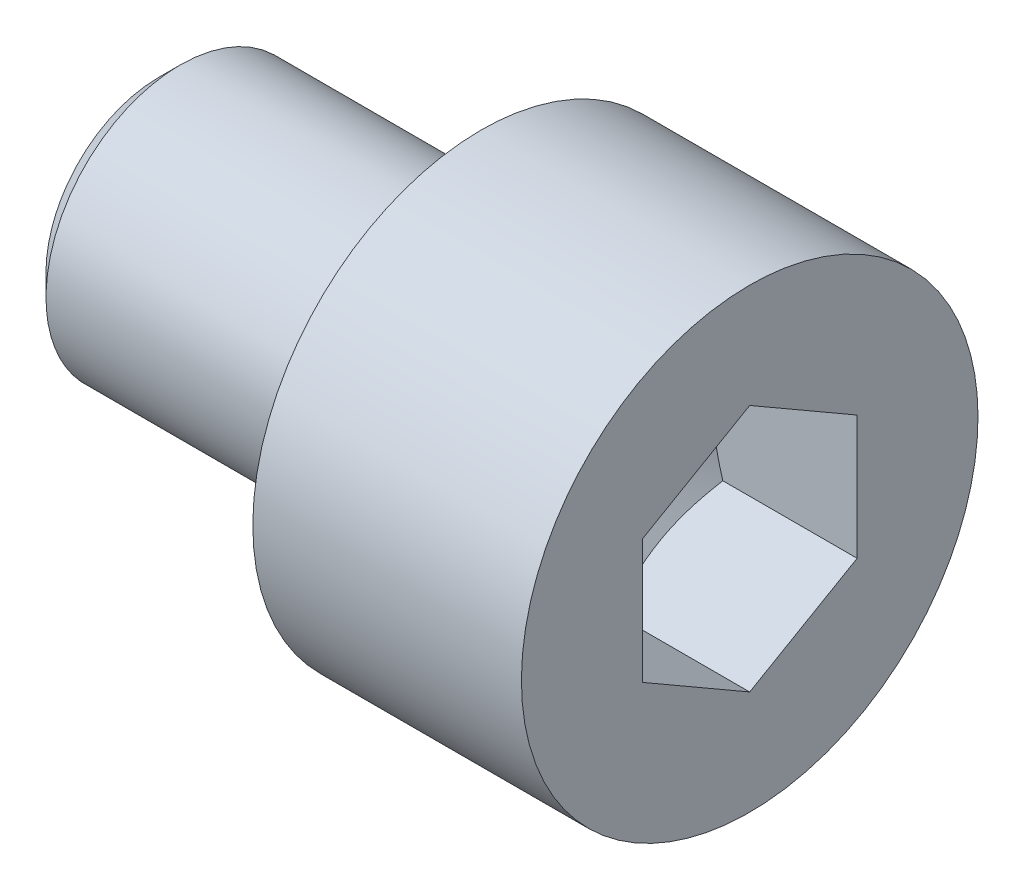
ISO-10303-21;
HEADER;
FILE_DESCRIPTION(('STEP AP214'),'2;1');
FILE_NAME('part.step','',(''),(''),'','','');
FILE_SCHEMA(('AUTOMOTIVE_DESIGN { 1 0 10303 214 1 1 1 1 }'));
ENDSEC;
DATA;
#1=APPLICATION_CONTEXT('core data for automotive mechanical design processes');
#2=APPLICATION_PROTOCOL_DEFINITION('international standard','automotive_design',2000,#1);
#3=PRODUCT_CONTEXT('',#1,'mechanical');
#4=PRODUCT('Part','Part','',(#3));
#5=PRODUCT_RELATED_PRODUCT_CATEGORY('part','',(#4));
#6=PRODUCT_DEFINITION_FORMATION('','',#4);
#7=PRODUCT_DEFINITION_CONTEXT('part definition',#1,'design');
#8=PRODUCT_DEFINITION('design','',#6,#7);
#9=PRODUCT_DEFINITION_SHAPE('','',#8);
#10=(LENGTH_UNIT() NAMED_UNIT(*) SI_UNIT(.MILLI.,.METRE.));
#11=(NAMED_UNIT(*) PLANE_ANGLE_UNIT() SI_UNIT($,.RADIAN.));
#12=(NAMED_UNIT(*) SI_UNIT($,.STERADIAN.) SOLID_ANGLE_UNIT());
#13=UNCERTAINTY_MEASURE_WITH_UNIT(LENGTH_MEASURE(1.E-05),#10,'distance_accuracy_value','');
#14=(GEOMETRIC_REPRESENTATION_CONTEXT(3) GLOBAL_UNCERTAINTY_ASSIGNED_CONTEXT((#13)) GLOBAL_UNIT_ASSIGNED_CONTEXT((#10,
#11,#12)) REPRESENTATION_CONTEXT('',''));
#15=CARTESIAN_POINT('',(0.,0.,0.));
#16=DIRECTION('',(0.,0.,1.));
#17=DIRECTION('',(1.,0.,0.));
#18=AXIS2_PLACEMENT_3D('',#15,#16,#17);
#19=CARTESIAN_POINT('',(0.099999999999972,-4.675,-4.675));
#20=CARTESIAN_POINT('',(0.099999999999972,-4.675,4.675));
#21=CARTESIAN_POINT('',(0.099999999999972,4.675,-4.675));
#22=CARTESIAN_POINT('',(0.099999999999972,4.675,4.675));
#23=(BOUNDED_SURFACE() B_SPLINE_SURFACE(1,1,((#19,#20),(#21,#22)),.UNSPECIFIED.,.F.,.F.,
.F.) B_SPLINE_SURFACE_WITH_KNOTS((2,2),(2,2),(0.,1.),(0.,1.),
.UNSPECIFIED.) GEOMETRIC_REPRESENTATION_ITEM() RATIONAL_B_SPLINE_SURFACE(((1.,1.),(1.,1.))) REPRESENTATION_ITEM('') SURFACE());
#24=CARTESIAN_POINT('',(0.099999999999975,2.30940107675856,0.));
#25=CARTESIAN_POINT('',(0.099999999999975,1.15470053837927,-1.99999999999994));
#26=(BOUNDED_CURVE() B_SPLINE_CURVE(1,(#24,#25),.UNSPECIFIED.,.F.,
.F.) B_SPLINE_CURVE_WITH_KNOTS((2,2),(0.,1.),
.UNSPECIFIED.) CURVE() GEOMETRIC_REPRESENTATION_ITEM() RATIONAL_B_SPLINE_CURVE((1.,1.)) REPRESENTATION_ITEM(''));
#27=CARTESIAN_POINT('',(0.099999999999975,2.30940107675852,0.));
#28=VERTEX_POINT('',#27);
#29=CARTESIAN_POINT('',(0.099999999999975,1.15470053837921,-1.99999999999992));
#30=VERTEX_POINT('',#29);
#31=EDGE_CURVE('P0_E168',#28,#30,#26,.T.);
#32=CARTESIAN_POINT('',(0.099999999999975,1.15470053837927,-1.99999999999994));
#33=CARTESIAN_POINT('',(0.099999999999975,-1.15470053837921,-1.99999999999993));
#34=(BOUNDED_CURVE() B_SPLINE_CURVE(1,(#32,#33),.UNSPECIFIED.,.F.,
.F.) B_SPLINE_CURVE_WITH_KNOTS((2,2),(0.,1.),
.UNSPECIFIED.) CURVE() GEOMETRIC_REPRESENTATION_ITEM() RATIONAL_B_SPLINE_CURVE((1.,1.)) REPRESENTATION_ITEM(''));
#35=CARTESIAN_POINT('',(0.099999999999975,-1.15470053837927,-1.99999999999989));
#36=VERTEX_POINT('',#35);
#37=EDGE_CURVE('P0_E189',#30,#36,#34,.T.);
#38=CARTESIAN_POINT('',(0.099999999999975,-1.15470053837921,-1.99999999999993));
#39=CARTESIAN_POINT('',(0.099999999999975,-2.30940107675845,1.101549E-13));
#40=(BOUNDED_CURVE() B_SPLINE_CURVE(1,(#38,#39),.UNSPECIFIED.,.F.,
.F.) B_SPLINE_CURVE_WITH_KNOTS((2,2),(0.,1.),
.UNSPECIFIED.) CURVE() GEOMETRIC_REPRESENTATION_ITEM() RATIONAL_B_SPLINE_CURVE((1.,1.)) REPRESENTATION_ITEM(''));
#41=CARTESIAN_POINT('',(0.099999999999975,-2.30940107675849,1.587272E-13));
#42=VERTEX_POINT('',#41);
#43=EDGE_CURVE('P0_E141',#36,#42,#40,.T.);
#44=CARTESIAN_POINT('',(0.099999999999975,-2.30940107675845,1.101549E-13));
#45=CARTESIAN_POINT('',(0.099999999999975,-1.15470053837918,2.0000000000001));
#46=(BOUNDED_CURVE() B_SPLINE_CURVE(1,(#44,#45),.UNSPECIFIED.,.F.,
.F.) B_SPLINE_CURVE_WITH_KNOTS((2,2),(0.,1.),
.UNSPECIFIED.) CURVE() GEOMETRIC_REPRESENTATION_ITEM() RATIONAL_B_SPLINE_CURVE((1.,1.)) REPRESENTATION_ITEM(''));
#47=CARTESIAN_POINT('',(0.099999999999975,-1.15470053837921,2.00000000000014));
#48=VERTEX_POINT('',#47);
#49=EDGE_CURVE('P0_E123',#42,#48,#46,.T.);
#50=CARTESIAN_POINT('',(0.099999999999975,-1.15470053837918,2.0000000000001));
#51=CARTESIAN_POINT('',(0.099999999999975,1.1547005383794,2.));
#52=(BOUNDED_CURVE() B_SPLINE_CURVE(1,(#50,#51),.UNSPECIFIED.,.F.,
.F.) B_SPLINE_CURVE_WITH_KNOTS((2,2),(0.,1.),
.UNSPECIFIED.) CURVE() GEOMETRIC_REPRESENTATION_ITEM() RATIONAL_B_SPLINE_CURVE((1.,1.)) REPRESENTATION_ITEM(''));
#53=CARTESIAN_POINT('',(0.099999999999975,1.15470053837937,2.00000000000005));
#54=VERTEX_POINT('',#53);
#55=EDGE_CURVE('P0_E153',#48,#54,#52,.T.);
#56=CARTESIAN_POINT('',(0.099999999999975,1.1547005383794,2.));
#57=CARTESIAN_POINT('',(0.099999999999975,2.30940107675856,0.));
#58=(BOUNDED_CURVE() B_SPLINE_CURVE(1,(#56,#57),.UNSPECIFIED.,.F.,
.F.) B_SPLINE_CURVE_WITH_KNOTS((2,2),(0.,1.),
.UNSPECIFIED.) CURVE() GEOMETRIC_REPRESENTATION_ITEM() RATIONAL_B_SPLINE_CURVE((1.,1.)) REPRESENTATION_ITEM(''));
#59=EDGE_CURVE('P0_E282',#54,#28,#58,.T.);
#60=CARTESIAN_POINT('',(0.099999999999972,4.25,0.));
#61=CARTESIAN_POINT('',(0.099999999999972,4.25,7.36121593216772));
#62=CARTESIAN_POINT('',(0.099999999999972,-2.125,3.68060796608386));
#63=CARTESIAN_POINT('',(0.099999999999972,-8.5,0.));
#64=CARTESIAN_POINT('',(0.099999999999972,-2.125,-3.68060796608386));
#65=CARTESIAN_POINT('',(0.099999999999972,4.25,-7.36121593216772));
#66=CARTESIAN_POINT('',(0.099999999999972,4.25,0.));
#67=(BOUNDED_CURVE() B_SPLINE_CURVE(2,(#60,#61,#62,#63,#64,#65,#66),.UNSPECIFIED.,.T.,
.F.) B_SPLINE_CURVE_WITH_KNOTS((3,2,2,3),(0.,0.333333333333333,0.666666666666667,1.),
.UNSPECIFIED.) CURVE() GEOMETRIC_REPRESENTATION_ITEM() RATIONAL_B_SPLINE_CURVE((1.,0.5,1.,0.5,
1.,0.5,1.)) REPRESENTATION_ITEM(''));
#68=CARTESIAN_POINT('',(0.099999999999972,4.25,0.));
#69=VERTEX_POINT('',#68);
#70=EDGE_CURVE('P0_E11',#69,#69,#67,.T.);
#71=ORIENTED_EDGE('',*,*,#31,.T.);
#72=ORIENTED_EDGE('',*,*,#37,.T.);
#73=ORIENTED_EDGE('',*,*,#43,.T.);
#74=ORIENTED_EDGE('',*,*,#49,.T.);
#75=ORIENTED_EDGE('',*,*,#55,.T.);
#76=ORIENTED_EDGE('',*,*,#59,.T.);
#77=EDGE_LOOP('',(#71,#72,#73,#74,#75,#76));
#78=FACE_BOUND('',#77,.T.);
#79=ORIENTED_EDGE('',*,*,#70,.T.);
#80=EDGE_LOOP('',(#79));
#81=FACE_BOUND('',#80,.T.);
#82=ADVANCED_FACE('P0_F16',(#78,#81),#23,.T.);
#83=CARTESIAN_POINT('',(-4.9,4.25,0.));
#84=CARTESIAN_POINT('',(0.099999999999972,4.25,0.));
#85=CARTESIAN_POINT('',(-4.9,4.25,7.36121593216772));
#86=CARTESIAN_POINT('',(0.099999999999972,4.25,7.36121593216772));
#87=CARTESIAN_POINT('',(-4.9,-2.125,3.68060796608387));
#88=CARTESIAN_POINT('',(0.099999999999972,-2.125,3.68060796608386));
#89=CARTESIAN_POINT('',(-4.9,-8.5,0.));
#90=CARTESIAN_POINT('',(0.099999999999972,-8.5,0.));
#91=CARTESIAN_POINT('',(-4.9,-2.125,-3.68060796608386));
#92=CARTESIAN_POINT('',(0.099999999999972,-2.125,-3.68060796608386));
#93=CARTESIAN_POINT('',(-4.9,4.25,-7.36121593216773));
#94=CARTESIAN_POINT('',(0.099999999999972,4.25,-7.36121593216772));
#95=CARTESIAN_POINT('',(-4.9,4.25,0.));
#96=CARTESIAN_POINT('',(0.099999999999972,4.25,0.));
#97=(BOUNDED_SURFACE() B_SPLINE_SURFACE(2,1,((#83,#84),(#85,#86),(#87,#88),(#89,#90),(#91,#92),
(#93,#94),(#95,#96)),.UNSPECIFIED.,.T.,.F.,.F.) B_SPLINE_SURFACE_WITH_KNOTS((3,2,2,3),(2,2),(0.,
0.333333333333333,0.666666666666667,1.),(0.,1.),
.UNSPECIFIED.) GEOMETRIC_REPRESENTATION_ITEM() RATIONAL_B_SPLINE_SURFACE(((1.,1.),(0.5,0.5),(1.,
1.),(0.5,0.5),(1.,1.),(0.5,0.5),(1.,1.))) REPRESENTATION_ITEM('') SURFACE());
#98=CARTESIAN_POINT('',(-4.9,4.25,0.));
#99=CARTESIAN_POINT('',(-4.9,4.25,7.36121593216772));
#100=CARTESIAN_POINT('',(-4.9,-2.125,3.68060796608387));
#101=CARTESIAN_POINT('',(-4.9,-8.5,0.));
#102=CARTESIAN_POINT('',(-4.9,-2.125,-3.68060796608386));
#103=CARTESIAN_POINT('',(-4.9,4.25,-7.36121593216773));
#104=CARTESIAN_POINT('',(-4.9,4.25,0.));
#105=(BOUNDED_CURVE() B_SPLINE_CURVE(2,(#98,#99,#100,#101,#102,#103,#104),.UNSPECIFIED.,.T.,
.F.) B_SPLINE_CURVE_WITH_KNOTS((3,2,2,3),(0.,0.333333333333333,0.666666666666667,1.),
.UNSPECIFIED.) CURVE() GEOMETRIC_REPRESENTATION_ITEM() RATIONAL_B_SPLINE_CURVE((1.,0.5,1.,0.5,
1.,0.5,1.)) REPRESENTATION_ITEM(''));
#106=CARTESIAN_POINT('',(-4.9,4.25,0.));
#107=VERTEX_POINT('',#106);
#108=EDGE_CURVE('P0_E204',#107,#107,#105,.T.);
#109=CARTESIAN_POINT('',(0.099999999999972,4.25,0.));
#110=CARTESIAN_POINT('',(-4.9,4.25,0.));
#111=(BOUNDED_CURVE() B_SPLINE_CURVE(1,(#109,#110),.UNSPECIFIED.,.F.,
.F.) B_SPLINE_CURVE_WITH_KNOTS((2,2),(0.,1.),
.UNSPECIFIED.) CURVE() GEOMETRIC_REPRESENTATION_ITEM() RATIONAL_B_SPLINE_CURVE((1.,1.)) REPRESENTATION_ITEM(''));
#112=EDGE_CURVE('P0_E29',#69,#107,#111,.T.);
#113=ORIENTED_EDGE('',*,*,#108,.T.);
#114=ORIENTED_EDGE('',*,*,#112,.F.);
#115=ORIENTED_EDGE('',*,*,#70,.F.);
#116=ORIENTED_EDGE('',*,*,#112,.T.);
#117=EDGE_LOOP('',(#113,#114,#115,#116));
#118=FACE_BOUND('',#117,.T.);
#119=ADVANCED_FACE('P0_F315',(#118),#97,.T.);
#120=CARTESIAN_POINT('',(-4.9,-4.675,4.675));
#121=CARTESIAN_POINT('',(-4.9,-4.675,-4.675));
#122=CARTESIAN_POINT('',(-4.9,4.675,4.675));
#123=CARTESIAN_POINT('',(-4.9,4.675,-4.675));
#124=(BOUNDED_SURFACE() B_SPLINE_SURFACE(1,1,((#120,#121),(#122,#123)),.UNSPECIFIED.,.F.,.F.,
.F.) B_SPLINE_SURFACE_WITH_KNOTS((2,2),(2,2),(0.,1.),(0.,1.),
.UNSPECIFIED.) GEOMETRIC_REPRESENTATION_ITEM() RATIONAL_B_SPLINE_SURFACE(((1.,1.),(1.,1.))) REPRESENTATION_ITEM('') SURFACE());
#125=CARTESIAN_POINT('',(-4.9,2.49999999999766,0.));
#126=CARTESIAN_POINT('',(-4.9,2.49999999999766,4.33012701891815));
#127=CARTESIAN_POINT('',(-4.9,-1.24999999999883,2.16506350945907));
#128=CARTESIAN_POINT('',(-4.9,-4.99999999999533,0.));
#129=CARTESIAN_POINT('',(-4.9,-1.24999999999883,-2.16506350945907));
#130=CARTESIAN_POINT('',(-4.9,2.49999999999766,-4.33012701891815));
#131=CARTESIAN_POINT('',(-4.9,2.49999999999766,0.));
#132=(BOUNDED_CURVE() B_SPLINE_CURVE(2,(#125,#126,#127,#128,#129,#130,#131),.UNSPECIFIED.,.T.,
.F.) B_SPLINE_CURVE_WITH_KNOTS((3,2,2,3),(0.,0.333333333333333,0.666666666666667,1.),
.UNSPECIFIED.) CURVE() GEOMETRIC_REPRESENTATION_ITEM() RATIONAL_B_SPLINE_CURVE((1.,0.5,1.,0.5,
1.,0.5,1.)) REPRESENTATION_ITEM(''));
#133=CARTESIAN_POINT('',(-4.9,2.49999999999766,0.));
#134=VERTEX_POINT('',#133);
#135=EDGE_CURVE('P0_E235',#134,#134,#132,.T.);
#136=ORIENTED_EDGE('',*,*,#135,.T.);
#137=EDGE_LOOP('',(#136));
#138=FACE_BOUND('',#137,.T.);
#139=ORIENTED_EDGE('',*,*,#108,.F.);
#140=EDGE_LOOP('',(#139));
#141=FACE_BOUND('',#140,.T.);
#142=ADVANCED_FACE('P0_F18',(#138,#141),#124,.T.);
#143=CARTESIAN_POINT('',(-5.7,2.49999999999768,0.));
#144=CARTESIAN_POINT('',(-4.9,2.49999999999766,0.));
#145=CARTESIAN_POINT('',(-5.7,2.49999999999768,4.33012701891817));
#146=CARTESIAN_POINT('',(-4.9,2.49999999999766,4.33012701891815));
#147=CARTESIAN_POINT('',(-5.7,-1.24999999999884,2.16506350945908));
#148=CARTESIAN_POINT('',(-4.9,-1.24999999999883,2.16506350945907));
#149=CARTESIAN_POINT('',(-5.7,-4.99999999999535,0.));
#150=CARTESIAN_POINT('',(-4.9,-4.99999999999532,0.));
#151=CARTESIAN_POINT('',(-5.7,-1.24999999999884,-2.16506350945908));
#152=CARTESIAN_POINT('',(-4.9,-1.24999999999883,-2.16506350945907));
#153=CARTESIAN_POINT('',(-5.7,2.49999999999768,-4.33012701891817));
#154=CARTESIAN_POINT('',(-4.9,2.49999999999766,-4.33012701891815));
#155=CARTESIAN_POINT('',(-5.7,2.49999999999768,0.));
#156=CARTESIAN_POINT('',(-4.9,2.49999999999766,0.));
#157=(BOUNDED_SURFACE() B_SPLINE_SURFACE(2,1,((#143,#144),(#145,#146),(#147,#148),(#149,#150),
(#151,#152),(#153,#154),(#155,#156)),.UNSPECIFIED.,.T.,.F.,.F.) B_SPLINE_SURFACE_WITH_KNOTS((3,
2,2,3),(2,2),(0.,0.333333333333333,0.666666666666667,1.),(0.,1.),
.UNSPECIFIED.) GEOMETRIC_REPRESENTATION_ITEM() RATIONAL_B_SPLINE_SURFACE(((1.,1.),(0.5,0.5),(1.,
1.),(0.5,0.5),(1.,1.),(0.5,0.5),(1.,1.))) REPRESENTATION_ITEM('') SURFACE());
#158=CARTESIAN_POINT('',(-5.7,2.49999999999768,0.));
#159=CARTESIAN_POINT('',(-5.7,2.49999999999768,4.33012701891817));
#160=CARTESIAN_POINT('',(-5.7,-1.24999999999884,2.16506350945908));
#161=CARTESIAN_POINT('',(-5.7,-4.99999999999535,0.));
#162=CARTESIAN_POINT('',(-5.7,-1.24999999999884,-2.16506350945908));
#163=CARTESIAN_POINT('',(-5.7,2.49999999999768,-4.33012701891817));
#164=CARTESIAN_POINT('',(-5.7,2.49999999999768,0.));
#165=(BOUNDED_CURVE() B_SPLINE_CURVE(2,(#158,#159,#160,#161,#162,#163,#164),.UNSPECIFIED.,.T.,
.F.) B_SPLINE_CURVE_WITH_KNOTS((3,2,2,3),(0.,0.333333333333333,0.666666666666667,1.),
.UNSPECIFIED.) CURVE() GEOMETRIC_REPRESENTATION_ITEM() RATIONAL_B_SPLINE_CURVE((1.,0.5,1.,0.5,
1.,0.5,1.)) REPRESENTATION_ITEM(''));
#166=CARTESIAN_POINT('',(-5.7,2.49999999999768,0.));
#167=VERTEX_POINT('',#166);
#168=EDGE_CURVE('P0_E236',#167,#167,#165,.T.);
#169=CARTESIAN_POINT('',(-4.9,2.49999999999766,0.));
#170=CARTESIAN_POINT('',(-5.7,2.49999999999768,0.));
#171=(BOUNDED_CURVE() B_SPLINE_CURVE(1,(#169,#170),.UNSPECIFIED.,.F.,
.F.) B_SPLINE_CURVE_WITH_KNOTS((2,2),(0.,1.),
.UNSPECIFIED.) CURVE() GEOMETRIC_REPRESENTATION_ITEM() RATIONAL_B_SPLINE_CURVE((1.,1.)) REPRESENTATION_ITEM(''));
#172=EDGE_CURVE('P0_E90',#134,#167,#171,.T.);
#173=ORIENTED_EDGE('',*,*,#168,.T.);
#174=ORIENTED_EDGE('',*,*,#172,.F.);
#175=ORIENTED_EDGE('',*,*,#135,.F.);
#176=ORIENTED_EDGE('',*,*,#172,.T.);
#177=EDGE_LOOP('',(#173,#174,#175,#176));
#178=FACE_BOUND('',#177,.T.);
#179=ADVANCED_FACE('P0_F318',(#178),#157,.T.);
#180=CARTESIAN_POINT('',(-5.7,-2.74999999999745,2.74999999999745));
#181=CARTESIAN_POINT('',(-5.7,-2.74999999999745,-2.74999999999745));
#182=CARTESIAN_POINT('',(-5.7,2.74999999999745,2.74999999999745));
#183=CARTESIAN_POINT('',(-5.7,2.74999999999745,-2.74999999999745));
#184=(BOUNDED_SURFACE() B_SPLINE_SURFACE(1,1,((#180,#181),(#182,#183)),.UNSPECIFIED.,.F.,.F.,
.F.) B_SPLINE_SURFACE_WITH_KNOTS((2,2),(2,2),(0.,1.),(0.,1.),
.UNSPECIFIED.) GEOMETRIC_REPRESENTATION_ITEM() RATIONAL_B_SPLINE_SURFACE(((1.,1.),(1.,1.))) REPRESENTATION_ITEM('') SURFACE());
#185=ORIENTED_EDGE('',*,*,#168,.F.);
#186=EDGE_LOOP('',(#185));
#187=FACE_BOUND('',#186,.T.);
#188=ADVANCED_FACE('P0_F326',(#187),#184,.T.);
#189=CARTESIAN_POINT('',(0.099999999999972,1.15470053837937,2.00000000000005));
#190=CARTESIAN_POINT('',(-3.80041507641945,1.15470053837937,2.00000000000005));
#191=CARTESIAN_POINT('',(0.099999999999972,2.30940107675852,0.));
#192=CARTESIAN_POINT('',(-3.80041507641945,2.30940107675852,0.));
#193=(BOUNDED_SURFACE() B_SPLINE_SURFACE(1,1,((#189,#190),(#191,#192)),.UNSPECIFIED.,.F.,.F.,
.F.) B_SPLINE_SURFACE_WITH_KNOTS((2,2),(2,2),(0.,1.),(0.,1.),
.UNSPECIFIED.) GEOMETRIC_REPRESENTATION_ITEM() RATIONAL_B_SPLINE_SURFACE(((1.,1.),(1.,1.))) REPRESENTATION_ITEM('') SURFACE());
#194=CARTESIAN_POINT('',(0.099999999999975,2.30940107675856,0.));
#195=CARTESIAN_POINT('',(-2.40000000000002,2.30940107675856,0.));
#196=(BOUNDED_CURVE() B_SPLINE_CURVE(1,(#194,#195),.UNSPECIFIED.,.F.,
.F.) B_SPLINE_CURVE_WITH_KNOTS((2,2),(0.,0.640957424022419),
.UNSPECIFIED.) CURVE() GEOMETRIC_REPRESENTATION_ITEM() RATIONAL_B_SPLINE_CURVE((1.,1.)) REPRESENTATION_ITEM(''));
#197=CARTESIAN_POINT('',(-2.40000000000002,2.30940107675855,0.));
#198=VERTEX_POINT('',#197);
#199=EDGE_CURVE('P0_E174',#28,#198,#196,.T.);
#200=CARTESIAN_POINT('',(-2.4,1.1547005383794,2.));
#201=CARTESIAN_POINT('',(0.099999999999975,1.1547005383794,2.));
#202=(BOUNDED_CURVE() B_SPLINE_CURVE(1,(#200,#201),.UNSPECIFIED.,.F.,
.F.) B_SPLINE_CURVE_WITH_KNOTS((2,2),(0.359042575977582,1.),
.UNSPECIFIED.) CURVE() GEOMETRIC_REPRESENTATION_ITEM() RATIONAL_B_SPLINE_CURVE((1.,1.)) REPRESENTATION_ITEM(''));
#203=CARTESIAN_POINT('',(-2.4,1.15470053837937,2.00000000000005));
#204=VERTEX_POINT('',#203);
#205=EDGE_CURVE('P0_E160',#204,#54,#202,.T.);
#206=CARTESIAN_POINT('',(-2.40000000000002,2.30940107675859,0.));
#207=CARTESIAN_POINT('',(-2.75010376910486,1.732050807569,1.00000000000003));
#208=CARTESIAN_POINT('',(-2.40000000000002,1.1547005383794,2.));
#209=(BOUNDED_CURVE() B_SPLINE_CURVE(2,(#206,#207,#208),.UNSPECIFIED.,.F.,
.F.) B_SPLINE_CURVE_WITH_KNOTS((3,3),(0.,1.),
.UNSPECIFIED.) CURVE() GEOMETRIC_REPRESENTATION_ITEM() RATIONAL_B_SPLINE_CURVE((1.,
1.15470053837924,1.)) REPRESENTATION_ITEM(''));
#210=EDGE_CURVE('P0_E146',#198,#204,#209,.T.);
#211=ORIENTED_EDGE('',*,*,#199,.F.);
#212=ORIENTED_EDGE('',*,*,#59,.F.);
#213=ORIENTED_EDGE('',*,*,#205,.F.);
#214=ORIENTED_EDGE('',*,*,#210,.F.);
#215=EDGE_LOOP('',(#211,#212,#213,#214));
#216=FACE_BOUND('',#215,.T.);
#217=ADVANCED_FACE('P0_F397',(#216),#193,.F.);
#218=CARTESIAN_POINT('',(-3.80041507641944,0.,0.));
#219=CARTESIAN_POINT('',(-2.40000000000002,2.3094010767586,0.));
#220=CARTESIAN_POINT('',(-3.80041507641944,0.,0.));
#221=CARTESIAN_POINT('',(-2.40000000000003,2.30940107675862,-4.00000000000006));
#222=CARTESIAN_POINT('',(-3.80041507641944,0.,0.));
#223=CARTESIAN_POINT('',(-2.40000000000002,-1.15470053837924,-2.00000000000003));
#224=CARTESIAN_POINT('',(-3.80041507641944,0.,0.));
#225=CARTESIAN_POINT('',(-2.40000000000003,-4.6188021535171,0.));
#226=CARTESIAN_POINT('',(-3.80041507641944,0.,0.));
#227=CARTESIAN_POINT('',(-2.40000000000002,-1.15470053837927,2.00000000000008));
#228=CARTESIAN_POINT('',(-3.80041507641944,0.,0.));
#229=CARTESIAN_POINT('',(-2.40000000000003,2.30940107675856,4.00000000000015));
#230=CARTESIAN_POINT('',(-3.80041507641944,0.,0.));
#231=CARTESIAN_POINT('',(-2.40000000000002,2.3094010767586,0.));
#232=(BOUNDED_SURFACE() B_SPLINE_SURFACE(2,1,((#218,#219),(#220,#221),(#222,#223),(#224,#225),
(#226,#227),(#228,#229),(#230,#231)),.UNSPECIFIED.,.T.,.F.,.F.) B_SPLINE_SURFACE_WITH_KNOTS((3,
2,2,3),(2,2),(0.,0.333333333333333,0.666666666666667,1.),(0.,1.),
.UNSPECIFIED.) GEOMETRIC_REPRESENTATION_ITEM() RATIONAL_B_SPLINE_SURFACE(((1.,1.),(0.5,0.5),(1.,
1.),(0.5,0.5),(1.,1.),(0.5,0.5),(1.,1.))) REPRESENTATION_ITEM('') SURFACE());
#233=CARTESIAN_POINT('',(-2.40000000000002,2.3094010767586,0.));
#234=CARTESIAN_POINT('',(-3.80041507641945,0.,0.));
#235=(BOUNDED_CURVE() B_SPLINE_CURVE(1,(#233,#234),.UNSPECIFIED.,.F.,
.F.) B_SPLINE_CURVE_WITH_KNOTS((2,2),(0.,1.),
.UNSPECIFIED.) CURVE() GEOMETRIC_REPRESENTATION_ITEM() RATIONAL_B_SPLINE_CURVE((1.,1.)) REPRESENTATION_ITEM(''));
#236=CARTESIAN_POINT('',(-3.80041507641945,0.,0.));
#237=VERTEX_POINT('',#236);
#238=EDGE_CURVE('P0_E101',#198,#237,#235,.T.);
#239=CARTESIAN_POINT('',(-2.4,1.1547005383794,2.));
#240=CARTESIAN_POINT('',(-2.75010376910488,1.05162E-13,2.00000000000006));
#241=CARTESIAN_POINT('',(-2.4,-1.15470053837919,2.0000000000001));
#242=(BOUNDED_CURVE() B_SPLINE_CURVE(2,(#239,#240,#241),.UNSPECIFIED.,.F.,
.F.) B_SPLINE_CURVE_WITH_KNOTS((3,3),(0.,1.),
.UNSPECIFIED.) CURVE() GEOMETRIC_REPRESENTATION_ITEM() RATIONAL_B_SPLINE_CURVE((1.,
1.15470053837926,1.)) REPRESENTATION_ITEM(''));
#243=CARTESIAN_POINT('',(-2.4,-1.15470053837921,2.00000000000014));
#244=VERTEX_POINT('',#243);
#245=EDGE_CURVE('P0_E144',#204,#244,#242,.T.);
#246=CARTESIAN_POINT('',(-2.4,-1.15470053837917,2.00000000000012));
#247=CARTESIAN_POINT('',(-2.7501037691049,-1.73205080756885,1.00000000000005));
#248=CARTESIAN_POINT('',(-2.4,-2.30940107675852,0.));
#249=(BOUNDED_CURVE() B_SPLINE_CURVE(2,(#246,#247,#248),.UNSPECIFIED.,.F.,
.F.) B_SPLINE_CURVE_WITH_KNOTS((3,3),(0.,1.),
.UNSPECIFIED.) CURVE() GEOMETRIC_REPRESENTATION_ITEM() RATIONAL_B_SPLINE_CURVE((1.,
1.15470053837927,1.)) REPRESENTATION_ITEM(''));
#250=CARTESIAN_POINT('',(-2.4,-2.30940107675849,1.587272E-13));
#251=VERTEX_POINT('',#250);
#252=EDGE_CURVE('P0_E131',#244,#251,#249,.T.);
#253=CARTESIAN_POINT('',(-2.4,-2.30940107675852,2.333203E-13));
#254=CARTESIAN_POINT('',(-2.75010376910496,-1.73205080756883,-0.999999999999922));
#255=CARTESIAN_POINT('',(-2.4,-1.15470053837913,-2.00000000000008));
#256=(BOUNDED_CURVE() B_SPLINE_CURVE(2,(#253,#254,#255),.UNSPECIFIED.,.F.,
.F.) B_SPLINE_CURVE_WITH_KNOTS((3,3),(0.,1.),
.UNSPECIFIED.) CURVE() GEOMETRIC_REPRESENTATION_ITEM() RATIONAL_B_SPLINE_CURVE((1.,
1.1547005383793,1.)) REPRESENTATION_ITEM(''));
#257=CARTESIAN_POINT('',(-2.4,-1.15470053837927,-1.99999999999989));
#258=VERTEX_POINT('',#257);
#259=EDGE_CURVE('P0_E182',#251,#258,#256,.T.);
#260=CARTESIAN_POINT('',(-2.4,-1.15470053837938,-1.99999999999993));
#261=CARTESIAN_POINT('',(-2.75010376910495,0.,-1.99999999999994));
#262=CARTESIAN_POINT('',(-2.4,1.15470053837943,-1.99999999999994));
#263=(BOUNDED_CURVE() B_SPLINE_CURVE(2,(#260,#261,#262),.UNSPECIFIED.,.F.,
.F.) B_SPLINE_CURVE_WITH_KNOTS((3,3),(0.,1.),
.UNSPECIFIED.) CURVE() GEOMETRIC_REPRESENTATION_ITEM() RATIONAL_B_SPLINE_CURVE((1.,
1.15470053837929,1.)) REPRESENTATION_ITEM(''));
#264=CARTESIAN_POINT('',(-2.40000000000002,1.15470053837921,-1.99999999999992));
#265=VERTEX_POINT('',#264);
#266=EDGE_CURVE('P0_E175',#258,#265,#263,.T.);
#267=CARTESIAN_POINT('',(-2.40000000000002,1.15470053837919,-2.00000000000009));
#268=CARTESIAN_POINT('',(-2.75010376910495,1.73205080756889,-0.999999999999985));
#269=CARTESIAN_POINT('',(-2.40000000000002,2.30940107675859,1.22298E-13));
#270=(BOUNDED_CURVE() B_SPLINE_CURVE(2,(#267,#268,#269),.UNSPECIFIED.,.F.,
.F.) B_SPLINE_CURVE_WITH_KNOTS((3,3),(0.,1.),
.UNSPECIFIED.) CURVE() GEOMETRIC_REPRESENTATION_ITEM() RATIONAL_B_SPLINE_CURVE((1.,
1.15470053837928,1.)) REPRESENTATION_ITEM(''));
#271=EDGE_CURVE('P0_E260',#265,#198,#270,.T.);
#272=ORIENTED_EDGE('',*,*,#238,.T.);
#273=ORIENTED_EDGE('',*,*,#238,.F.);
#274=ORIENTED_EDGE('',*,*,#210,.T.);
#275=ORIENTED_EDGE('',*,*,#245,.T.);
#276=ORIENTED_EDGE('',*,*,#252,.T.);
#277=ORIENTED_EDGE('',*,*,#259,.T.);
#278=ORIENTED_EDGE('',*,*,#266,.T.);
#279=ORIENTED_EDGE('',*,*,#271,.T.);
#280=EDGE_LOOP('',(#272,#273,#274,#275,#276,#277,#278,#279));
#281=FACE_BOUND('',#280,.T.);
#282=ADVANCED_FACE('P0_F145',(#281),#232,.T.);
#283=CARTESIAN_POINT('',(0.099999999999972,2.30940107675852,0.));
#284=CARTESIAN_POINT('',(-3.80041507641945,2.30940107675852,0.));
#285=CARTESIAN_POINT('',(0.099999999999972,1.15470053837921,-1.99999999999992));
#286=CARTESIAN_POINT('',(-3.80041507641945,1.15470053837921,-1.99999999999992));
#287=(BOUNDED_SURFACE() B_SPLINE_SURFACE(1,1,((#283,#284),(#285,#286)),.UNSPECIFIED.,.F.,.F.,
.F.) B_SPLINE_SURFACE_WITH_KNOTS((2,2),(2,2),(0.,1.),(0.,1.),
.UNSPECIFIED.) GEOMETRIC_REPRESENTATION_ITEM() RATIONAL_B_SPLINE_SURFACE(((1.,1.),(1.,1.))) REPRESENTATION_ITEM('') SURFACE());
#288=CARTESIAN_POINT('',(-2.40000000000002,1.15470053837927,-1.99999999999994));
#289=CARTESIAN_POINT('',(0.099999999999975,1.15470053837927,-1.99999999999994));
#290=(BOUNDED_CURVE() B_SPLINE_CURVE(1,(#288,#289),.UNSPECIFIED.,.F.,
.F.) B_SPLINE_CURVE_WITH_KNOTS((2,2),(0.359042575977581,1.),
.UNSPECIFIED.) CURVE() GEOMETRIC_REPRESENTATION_ITEM() RATIONAL_B_SPLINE_CURVE((1.,1.)) REPRESENTATION_ITEM(''));
#291=EDGE_CURVE('P0_E220',#265,#30,#290,.T.);
#292=ORIENTED_EDGE('',*,*,#291,.T.);
#293=ORIENTED_EDGE('',*,*,#31,.F.);
#294=ORIENTED_EDGE('',*,*,#199,.T.);
#295=ORIENTED_EDGE('',*,*,#271,.F.);
#296=EDGE_LOOP('',(#292,#293,#294,#295));
#297=FACE_BOUND('',#296,.T.);
#298=ADVANCED_FACE('P0_F339',(#297),#287,.F.);
#299=CARTESIAN_POINT('',(0.099999999999972,1.15470053837921,-1.99999999999992));
#300=CARTESIAN_POINT('',(-3.80041507641945,1.15470053837921,-1.99999999999992));
#301=CARTESIAN_POINT('',(0.099999999999972,-1.15470053837927,-1.99999999999989));
#302=CARTESIAN_POINT('',(-3.80041507641945,-1.15470053837927,-1.99999999999989));
#303=(BOUNDED_SURFACE() B_SPLINE_SURFACE(1,1,((#299,#300),(#301,#302)),.UNSPECIFIED.,.F.,.F.,
.F.) B_SPLINE_SURFACE_WITH_KNOTS((2,2),(2,2),(0.,1.),(0.,1.),
.UNSPECIFIED.) GEOMETRIC_REPRESENTATION_ITEM() RATIONAL_B_SPLINE_SURFACE(((1.,1.),(1.,1.))) REPRESENTATION_ITEM('') SURFACE());
#304=CARTESIAN_POINT('',(-2.4,-1.15470053837921,-1.99999999999993));
#305=CARTESIAN_POINT('',(0.099999999999975,-1.15470053837921,-1.99999999999993));
#306=(BOUNDED_CURVE() B_SPLINE_CURVE(1,(#304,#305),.UNSPECIFIED.,.F.,
.F.) B_SPLINE_CURVE_WITH_KNOTS((2,2),(0.359042575977582,1.),
.UNSPECIFIED.) CURVE() GEOMETRIC_REPRESENTATION_ITEM() RATIONAL_B_SPLINE_CURVE((1.,1.)) REPRESENTATION_ITEM(''));
#307=EDGE_CURVE('P0_E190',#258,#36,#306,.T.);
#308=ORIENTED_EDGE('',*,*,#307,.T.);
#309=ORIENTED_EDGE('',*,*,#37,.F.);
#310=ORIENTED_EDGE('',*,*,#291,.F.);
#311=ORIENTED_EDGE('',*,*,#266,.F.);
#312=EDGE_LOOP('',(#308,#309,#310,#311));
#313=FACE_BOUND('',#312,.T.);
#314=ADVANCED_FACE('P0_F349',(#313),#303,.F.);
#315=CARTESIAN_POINT('',(0.099999999999972,-1.15470053837927,-1.99999999999989));
#316=CARTESIAN_POINT('',(-3.80041507641945,-1.15470053837927,-1.99999999999989));
#317=CARTESIAN_POINT('',(0.099999999999972,-2.30940107675849,1.587272E-13));
#318=CARTESIAN_POINT('',(-3.80041507641945,-2.30940107675849,1.587272E-13));
#319=(BOUNDED_SURFACE() B_SPLINE_SURFACE(1,1,((#315,#316),(#317,#318)),.UNSPECIFIED.,.F.,.F.,
.F.) B_SPLINE_SURFACE_WITH_KNOTS((2,2),(2,2),(0.,1.),(0.,1.),
.UNSPECIFIED.) GEOMETRIC_REPRESENTATION_ITEM() RATIONAL_B_SPLINE_SURFACE(((1.,1.),(1.,1.))) REPRESENTATION_ITEM('') SURFACE());
#320=CARTESIAN_POINT('',(-2.4,-2.30940107675845,0.));
#321=CARTESIAN_POINT('',(0.099999999999975,-2.30940107675845,0.));
#322=(BOUNDED_CURVE() B_SPLINE_CURVE(1,(#320,#321),.UNSPECIFIED.,.F.,
.F.) B_SPLINE_CURVE_WITH_KNOTS((2,2),(0.359042575977584,1.),
.UNSPECIFIED.) CURVE() GEOMETRIC_REPRESENTATION_ITEM() RATIONAL_B_SPLINE_CURVE((1.,1.)) REPRESENTATION_ITEM(''));
#323=EDGE_CURVE('P0_E138',#251,#42,#322,.T.);
#324=ORIENTED_EDGE('',*,*,#323,.T.);
#325=ORIENTED_EDGE('',*,*,#43,.F.);
#326=ORIENTED_EDGE('',*,*,#307,.F.);
#327=ORIENTED_EDGE('',*,*,#259,.F.);
#328=EDGE_LOOP('',(#324,#325,#326,#327));
#329=FACE_BOUND('',#328,.T.);
#330=ADVANCED_FACE('P0_F360',(#329),#319,.F.);
#331=CARTESIAN_POINT('',(0.099999999999972,-2.30940107675849,1.587272E-13));
#332=CARTESIAN_POINT('',(-3.80041507641945,-2.30940107675849,1.587272E-13));
#333=CARTESIAN_POINT('',(0.099999999999972,-1.15470053837921,2.00000000000014));
#334=CARTESIAN_POINT('',(-3.80041507641945,-1.15470053837921,2.00000000000014));
#335=(BOUNDED_SURFACE() B_SPLINE_SURFACE(1,1,((#331,#332),(#333,#334)),.UNSPECIFIED.,.F.,.F.,
.F.) B_SPLINE_SURFACE_WITH_KNOTS((2,2),(2,2),(0.,1.),(0.,1.),
.UNSPECIFIED.) GEOMETRIC_REPRESENTATION_ITEM() RATIONAL_B_SPLINE_SURFACE(((1.,1.),(1.,1.))) REPRESENTATION_ITEM('') SURFACE());
#336=CARTESIAN_POINT('',(-2.4,-1.15470053837918,2.0000000000001));
#337=CARTESIAN_POINT('',(0.099999999999975,-1.15470053837918,2.0000000000001));
#338=(BOUNDED_CURVE() B_SPLINE_CURVE(1,(#336,#337),.UNSPECIFIED.,.F.,
.F.) B_SPLINE_CURVE_WITH_KNOTS((2,2),(0.359042575977584,1.),
.UNSPECIFIED.) CURVE() GEOMETRIC_REPRESENTATION_ITEM() RATIONAL_B_SPLINE_CURVE((1.,1.)) REPRESENTATION_ITEM(''));
#339=EDGE_CURVE('P0_E135',#244,#48,#338,.T.);
#340=ORIENTED_EDGE('',*,*,#339,.T.);
#341=ORIENTED_EDGE('',*,*,#49,.F.);
#342=ORIENTED_EDGE('',*,*,#323,.F.);
#343=ORIENTED_EDGE('',*,*,#252,.F.);
#344=EDGE_LOOP('',(#340,#341,#342,#343));
#345=FACE_BOUND('',#344,.T.);
#346=ADVANCED_FACE('P0_F133',(#345),#335,.F.);
#347=CARTESIAN_POINT('',(0.099999999999972,-1.15470053837921,2.00000000000014));
#348=CARTESIAN_POINT('',(-3.80041507641945,-1.15470053837921,2.00000000000014));
#349=CARTESIAN_POINT('',(0.099999999999972,1.15470053837937,2.00000000000005));
#350=CARTESIAN_POINT('',(-3.80041507641945,1.15470053837937,2.00000000000005));
#351=(BOUNDED_SURFACE() B_SPLINE_SURFACE(1,1,((#347,#348),(#349,#350)),.UNSPECIFIED.,.F.,.F.,
.F.) B_SPLINE_SURFACE_WITH_KNOTS((2,2),(2,2),(0.,1.),(0.,1.),
.UNSPECIFIED.) GEOMETRIC_REPRESENTATION_ITEM() RATIONAL_B_SPLINE_SURFACE(((1.,1.),(1.,1.))) REPRESENTATION_ITEM('') SURFACE());
#352=ORIENTED_EDGE('',*,*,#205,.T.);
#353=ORIENTED_EDGE('',*,*,#55,.F.);
#354=ORIENTED_EDGE('',*,*,#339,.F.);
#355=ORIENTED_EDGE('',*,*,#245,.F.);
#356=EDGE_LOOP('',(#352,#353,#354,#355));
#357=FACE_BOUND('',#356,.T.);
#358=ADVANCED_FACE('P0_F152',(#357),#351,.F.);
#359=CLOSED_SHELL('',(#82,#119,#142,#179,#188,#217,#282,#298,#314,#330,#346,#358));
#360=MANIFOLD_SOLID_BREP('P0_B1',#359);
#361=CARTESIAN_POINT('',(-5.72,-2.288,-2.288));
#362=CARTESIAN_POINT('',(-5.72,-2.288,2.288));
#363=CARTESIAN_POINT('',(-5.72,2.288,-2.288));
#364=CARTESIAN_POINT('',(-5.72,2.288,2.288));
#365=(BOUNDED_SURFACE() B_SPLINE_SURFACE(1,1,((#361,#362),(#363,#364)),.UNSPECIFIED.,.F.,.F.,
.F.) B_SPLINE_SURFACE_WITH_KNOTS((2,2),(2,2),(0.,1.),(0.,1.),
.UNSPECIFIED.) GEOMETRIC_REPRESENTATION_ITEM() RATIONAL_B_SPLINE_SURFACE(((1.,1.),(1.,1.))) REPRESENTATION_ITEM('') SURFACE());
#366=CARTESIAN_POINT('',(-5.72,2.08,0.));
#367=CARTESIAN_POINT('',(-5.72,2.08,3.60266567974325));
#368=CARTESIAN_POINT('',(-5.72,-1.04,1.80133283987163));
#369=CARTESIAN_POINT('',(-5.72,-4.16,0.));
#370=CARTESIAN_POINT('',(-5.72,-1.04,-1.80133283987163));
#371=CARTESIAN_POINT('',(-5.72,2.08,-3.60266567974325));
#372=CARTESIAN_POINT('',(-5.72,2.08,0.));
#373=(BOUNDED_CURVE() B_SPLINE_CURVE(2,(#366,#367,#368,#369,#370,#371,#372),.UNSPECIFIED.,.T.,
.F.) B_SPLINE_CURVE_WITH_KNOTS((3,2,2,3),(0.,0.333333333333333,0.666666666666667,1.),
.UNSPECIFIED.) CURVE() GEOMETRIC_REPRESENTATION_ITEM() RATIONAL_B_SPLINE_CURVE((1.,0.5,1.,0.5,
1.,0.5,1.)) REPRESENTATION_ITEM(''));
#374=CARTESIAN_POINT('',(-5.72,2.08,0.));
#375=VERTEX_POINT('',#374);
#376=EDGE_CURVE('P1_E11',#375,#375,#373,.T.);
#377=ORIENTED_EDGE('',*,*,#376,.T.);
#378=EDGE_LOOP('',(#377));
#379=FACE_BOUND('',#378,.T.);
#380=ADVANCED_FACE('P1_F16',(#379),#365,.T.);
#381=CARTESIAN_POINT('',(-10.9,2.08,0.));
#382=CARTESIAN_POINT('',(-5.72,2.08,0.));
#383=CARTESIAN_POINT('',(-10.9,2.08,3.60266567974327));
#384=CARTESIAN_POINT('',(-5.72,2.08,3.60266567974325));
#385=CARTESIAN_POINT('',(-10.9,-1.04,1.80133283987164));
#386=CARTESIAN_POINT('',(-5.72,-1.04,1.80133283987163));
#387=CARTESIAN_POINT('',(-10.9,-4.16,0.));
#388=CARTESIAN_POINT('',(-5.72,-4.16,0.));
#389=CARTESIAN_POINT('',(-10.9,-1.04,-1.80133283987164));
#390=CARTESIAN_POINT('',(-5.72,-1.04,-1.80133283987163));
#391=CARTESIAN_POINT('',(-10.9,2.08,-3.60266567974327));
#392=CARTESIAN_POINT('',(-5.72,2.08,-3.60266567974325));
#393=CARTESIAN_POINT('',(-10.9,2.08,0.));
#394=CARTESIAN_POINT('',(-5.72,2.08,0.));
#395=(BOUNDED_SURFACE() B_SPLINE_SURFACE(2,1,((#381,#382),(#383,#384),(#385,#386),(#387,#388),
(#389,#390),(#391,#392),(#393,#394)),.UNSPECIFIED.,.T.,.F.,.F.) B_SPLINE_SURFACE_WITH_KNOTS((3,
2,2,3),(2,2),(0.,0.333333333333333,0.666666666666667,1.),(0.,1.),
.UNSPECIFIED.) GEOMETRIC_REPRESENTATION_ITEM() RATIONAL_B_SPLINE_SURFACE(((1.,1.),(0.5,0.5),(1.,
1.),(0.5,0.5),(1.,1.),(0.5,0.5),(1.,1.))) REPRESENTATION_ITEM('') SURFACE());
#396=CARTESIAN_POINT('',(-10.9,2.08,0.));
#397=CARTESIAN_POINT('',(-10.9,2.08,-3.60266567974327));
#398=CARTESIAN_POINT('',(-10.9,-1.04,-1.80133283987164));
#399=CARTESIAN_POINT('',(-10.9,-4.16,0.));
#400=CARTESIAN_POINT('',(-10.9,-1.04,1.80133283987164));
#401=CARTESIAN_POINT('',(-10.9,2.08,3.60266567974327));
#402=CARTESIAN_POINT('',(-10.9,2.08,0.));
#403=(BOUNDED_CURVE() B_SPLINE_CURVE(2,(#396,#397,#398,#399,#400,#401,#402),.UNSPECIFIED.,.T.,
.F.) B_SPLINE_CURVE_WITH_KNOTS((3,2,2,3),(0.,0.333333333333333,0.666666666666667,1.),
.UNSPECIFIED.) CURVE() GEOMETRIC_REPRESENTATION_ITEM() RATIONAL_B_SPLINE_CURVE((1.,0.5,1.,0.5,
1.,0.5,1.)) REPRESENTATION_ITEM(''));
#404=CARTESIAN_POINT('',(-10.9,2.08,0.));
#405=VERTEX_POINT('',#404);
#406=EDGE_CURVE('P1_E47',#405,#405,#403,.T.);
#407=CARTESIAN_POINT('',(-5.72,2.08,0.));
#408=CARTESIAN_POINT('',(-10.9,2.08,0.));
#409=(BOUNDED_CURVE() B_SPLINE_CURVE(1,(#407,#408),.UNSPECIFIED.,.F.,
.F.) B_SPLINE_CURVE_WITH_KNOTS((2,2),(0.,1.),
.UNSPECIFIED.) CURVE() GEOMETRIC_REPRESENTATION_ITEM() RATIONAL_B_SPLINE_CURVE((1.,1.)) REPRESENTATION_ITEM(''));
#410=EDGE_CURVE('P1_E21',#375,#405,#409,.T.);
#411=ORIENTED_EDGE('',*,*,#406,.F.);
#412=ORIENTED_EDGE('',*,*,#410,.F.);
#413=ORIENTED_EDGE('',*,*,#376,.F.);
#414=ORIENTED_EDGE('',*,*,#410,.T.);
#415=EDGE_LOOP('',(#411,#412,#413,#414));
#416=FACE_BOUND('',#415,.T.);
#417=ADVANCED_FACE('P1_F46',(#416),#395,.T.);
#418=CARTESIAN_POINT('',(-10.9,-2.288,2.288));
#419=CARTESIAN_POINT('',(-10.9,-2.288,-2.288));
#420=CARTESIAN_POINT('',(-10.9,2.288,2.288));
#421=CARTESIAN_POINT('',(-10.9,2.288,-2.288));
#422=(BOUNDED_SURFACE() B_SPLINE_SURFACE(1,1,((#418,#419),(#420,#421)),.UNSPECIFIED.,.F.,.F.,
.F.) B_SPLINE_SURFACE_WITH_KNOTS((2,2),(2,2),(0.,1.),(0.,1.),
.UNSPECIFIED.) GEOMETRIC_REPRESENTATION_ITEM() RATIONAL_B_SPLINE_SURFACE(((1.,1.),(1.,1.))) REPRESENTATION_ITEM('') SURFACE());
#423=ORIENTED_EDGE('',*,*,#406,.T.);
#424=EDGE_LOOP('',(#423));
#425=FACE_BOUND('',#424,.T.);
#426=ADVANCED_FACE('P1_F50',(#425),#422,.T.);
#427=CLOSED_SHELL('',(#380,#417,#426));
#428=MANIFOLD_SOLID_BREP('P1_B1',#427);
#429=CARTESIAN_POINT('',(-10.5000000000024,2.49999999999768,0.));
#430=CARTESIAN_POINT('',(-5.72,2.49999999999768,0.));
#431=CARTESIAN_POINT('',(-10.5000000000024,2.49999999999767,4.33012701891816));
#432=CARTESIAN_POINT('',(-5.72,2.49999999999768,4.33012701891817));
#433=CARTESIAN_POINT('',(-10.5000000000024,-1.24999999999883,2.16506350945908));
#434=CARTESIAN_POINT('',(-5.72,-1.24999999999884,2.16506350945908));
#435=CARTESIAN_POINT('',(-10.5000000000024,-4.99999999999534,0.));
#436=CARTESIAN_POINT('',(-5.72,-4.99999999999535,0.));
#437=CARTESIAN_POINT('',(-10.5000000000024,-1.24999999999884,-2.16506350945908));
#438=CARTESIAN_POINT('',(-5.72,-1.24999999999884,-2.16506350945908));
#439=CARTESIAN_POINT('',(-10.5000000000024,2.49999999999767,-4.33012701891816));
#440=CARTESIAN_POINT('',(-5.72,2.49999999999768,-4.33012701891817));
#441=CARTESIAN_POINT('',(-10.5000000000024,2.49999999999768,0.));
#442=CARTESIAN_POINT('',(-5.72,2.49999999999768,0.));
#443=(BOUNDED_SURFACE() B_SPLINE_SURFACE(2,1,((#429,#430),(#431,#432),(#433,#434),(#435,#436),
(#437,#438),(#439,#440),(#441,#442)),.UNSPECIFIED.,.T.,.F.,.F.) B_SPLINE_SURFACE_WITH_KNOTS((3,
2,2,3),(2,2),(0.,0.333333333333333,0.666666666666667,1.),(0.,1.),
.UNSPECIFIED.) GEOMETRIC_REPRESENTATION_ITEM() RATIONAL_B_SPLINE_SURFACE(((1.,1.),(0.5,0.5),(1.,
1.),(0.5,0.5),(1.,1.),(0.5,0.5),(1.,1.))) REPRESENTATION_ITEM('') SURFACE());
#444=CARTESIAN_POINT('',(-10.5000000000024,2.49999999999768,0.));
#445=CARTESIAN_POINT('',(-10.5000000000024,2.49999999999767,-4.33012701891816));
#446=CARTESIAN_POINT('',(-10.5000000000024,-1.24999999999884,-2.16506350945908));
#447=CARTESIAN_POINT('',(-10.5000000000024,-4.99999999999534,0.));
#448=CARTESIAN_POINT('',(-10.5000000000024,-1.24999999999883,2.16506350945908));
#449=CARTESIAN_POINT('',(-10.5000000000024,2.49999999999767,4.33012701891816));
#450=CARTESIAN_POINT('',(-10.5000000000024,2.49999999999768,0.));
#451=(BOUNDED_CURVE() B_SPLINE_CURVE(2,(#444,#445,#446,#447,#448,#449,#450),.UNSPECIFIED.,.T.,
.F.) B_SPLINE_CURVE_WITH_KNOTS((3,2,2,3),(0.,0.333333333333333,0.666666666666667,1.),
.UNSPECIFIED.) CURVE() GEOMETRIC_REPRESENTATION_ITEM() RATIONAL_B_SPLINE_CURVE((1.,0.5,1.,0.5,
1.,0.5,1.)) REPRESENTATION_ITEM(''));
#452=CARTESIAN_POINT('',(-10.5000000000024,2.49999999999768,0.));
#453=VERTEX_POINT('',#452);
#454=EDGE_CURVE('P2_E29',#453,#453,#451,.T.);
#455=CARTESIAN_POINT('',(-5.72,2.49999999999768,0.));
#456=CARTESIAN_POINT('',(-10.5000000000024,2.49999999999768,0.));
#457=(BOUNDED_CURVE() B_SPLINE_CURVE(1,(#455,#456),.UNSPECIFIED.,.F.,
.F.) B_SPLINE_CURVE_WITH_KNOTS((2,2),(0.,1.),
.UNSPECIFIED.) CURVE() GEOMETRIC_REPRESENTATION_ITEM() RATIONAL_B_SPLINE_CURVE((1.,1.)) REPRESENTATION_ITEM(''));
#458=CARTESIAN_POINT('',(-5.72,2.49999999999768,0.));
#459=VERTEX_POINT('',#458);
#460=EDGE_CURVE('P2_E11',#459,#453,#457,.T.);
#461=CARTESIAN_POINT('',(-5.72,2.49999999999768,0.));
#462=CARTESIAN_POINT('',(-5.72,2.49999999999768,4.33012701891817));
#463=CARTESIAN_POINT('',(-5.72,-1.24999999999884,2.16506350945908));
#464=CARTESIAN_POINT('',(-5.72,-4.99999999999536,0.));
#465=CARTESIAN_POINT('',(-5.72,-1.24999999999884,-2.16506350945908));
#466=CARTESIAN_POINT('',(-5.72,2.49999999999768,-4.33012701891817));
#467=CARTESIAN_POINT('',(-5.72,2.49999999999768,0.));
#468=(BOUNDED_CURVE() B_SPLINE_CURVE(2,(#461,#462,#463,#464,#465,#466,#467),.UNSPECIFIED.,.T.,
.F.) B_SPLINE_CURVE_WITH_KNOTS((3,2,2,3),(0.,0.333333333333333,0.666666666666667,1.),
.UNSPECIFIED.) CURVE() GEOMETRIC_REPRESENTATION_ITEM() RATIONAL_B_SPLINE_CURVE((1.,0.5,1.,0.5,
1.,0.5,1.)) REPRESENTATION_ITEM(''));
#469=EDGE_CURVE('P2_E60',#459,#459,#468,.T.);
#470=ORIENTED_EDGE('',*,*,#454,.F.);
#471=ORIENTED_EDGE('',*,*,#460,.F.);
#472=ORIENTED_EDGE('',*,*,#469,.F.);
#473=ORIENTED_EDGE('',*,*,#460,.T.);
#474=EDGE_LOOP('',(#470,#471,#472,#473));
#475=FACE_BOUND('',#474,.T.);
#476=ADVANCED_FACE('P2_F16',(#475),#443,.T.);
#477=CARTESIAN_POINT('',(-10.9,2.1,0.));
#478=CARTESIAN_POINT('',(-10.5000000000024,2.49999999999768,0.));
#479=CARTESIAN_POINT('',(-10.9,2.1,3.63730669589464));
#480=CARTESIAN_POINT('',(-10.5000000000024,2.49999999999767,4.33012701891816));
#481=CARTESIAN_POINT('',(-10.9,-1.05,1.81865334794732));
#482=CARTESIAN_POINT('',(-10.5000000000024,-1.24999999999883,2.16506350945908));
#483=CARTESIAN_POINT('',(-10.9,-4.2,0.));
#484=CARTESIAN_POINT('',(-10.5000000000024,-4.99999999999534,0.));
#485=CARTESIAN_POINT('',(-10.9,-1.05,-1.81865334794732));
#486=CARTESIAN_POINT('',(-10.5000000000024,-1.24999999999884,-2.16506350945908));
#487=CARTESIAN_POINT('',(-10.9,2.1,-3.63730669589464));
#488=CARTESIAN_POINT('',(-10.5000000000024,2.49999999999767,-4.33012701891816));
#489=CARTESIAN_POINT('',(-10.9,2.1,0.));
#490=CARTESIAN_POINT('',(-10.5000000000024,2.49999999999768,0.));
#491=(BOUNDED_SURFACE() B_SPLINE_SURFACE(2,1,((#477,#478),(#479,#480),(#481,#482),(#483,#484),
(#485,#486),(#487,#488),(#489,#490)),.UNSPECIFIED.,.T.,.F.,.F.) B_SPLINE_SURFACE_WITH_KNOTS((3,
2,2,3),(2,2),(0.,0.333333333333333,0.666666666666667,1.),(0.,1.),
.UNSPECIFIED.) GEOMETRIC_REPRESENTATION_ITEM() RATIONAL_B_SPLINE_SURFACE(((1.,1.),(0.5,0.5),(1.,
1.),(0.5,0.5),(1.,1.),(0.5,0.5),(1.,1.))) REPRESENTATION_ITEM('') SURFACE());
#492=CARTESIAN_POINT('',(-10.9,2.1,0.));
#493=CARTESIAN_POINT('',(-10.9,2.1,3.63730669589464));
#494=CARTESIAN_POINT('',(-10.9,-1.05,1.81865334794732));
#495=CARTESIAN_POINT('',(-10.9,-4.2,0.));
#496=CARTESIAN_POINT('',(-10.9,-1.05,-1.81865334794732));
#497=CARTESIAN_POINT('',(-10.9,2.1,-3.63730669589464));
#498=CARTESIAN_POINT('',(-10.9,2.1,0.));
#499=(BOUNDED_CURVE() B_SPLINE_CURVE(2,(#492,#493,#494,#495,#496,#497,#498),.UNSPECIFIED.,.T.,
.F.) B_SPLINE_CURVE_WITH_KNOTS((3,2,2,3),(0.,0.333333333333333,0.666666666666667,1.),
.UNSPECIFIED.) CURVE() GEOMETRIC_REPRESENTATION_ITEM() RATIONAL_B_SPLINE_CURVE((1.,0.5,1.,0.5,
1.,0.5,1.)) REPRESENTATION_ITEM(''));
#500=CARTESIAN_POINT('',(-10.9,2.1,0.));
#501=VERTEX_POINT('',#500);
#502=EDGE_CURVE('P2_E98',#501,#501,#499,.T.);
#503=CARTESIAN_POINT('',(-10.5000000000024,2.49999999999768,0.));
#504=CARTESIAN_POINT('',(-10.9,2.1,0.));
#505=(BOUNDED_CURVE() B_SPLINE_CURVE(1,(#503,#504),.UNSPECIFIED.,.F.,
.F.) B_SPLINE_CURVE_WITH_KNOTS((2,2),(0.,1.),
.UNSPECIFIED.) CURVE() GEOMETRIC_REPRESENTATION_ITEM() RATIONAL_B_SPLINE_CURVE((1.,1.)) REPRESENTATION_ITEM(''));
#506=EDGE_CURVE('P2_E21',#453,#501,#505,.T.);
#507=ORIENTED_EDGE('',*,*,#502,.T.);
#508=ORIENTED_EDGE('',*,*,#506,.F.);
#509=ORIENTED_EDGE('',*,*,#454,.T.);
#510=ORIENTED_EDGE('',*,*,#506,.T.);
#511=EDGE_LOOP('',(#507,#508,#509,#510));
#512=FACE_BOUND('',#511,.T.);
#513=ADVANCED_FACE('P2_F135',(#512),#491,.T.);
#514=CARTESIAN_POINT('',(-5.72,2.1,0.));
#515=CARTESIAN_POINT('',(-10.9,2.1,0.));
#516=CARTESIAN_POINT('',(-5.72,2.1,3.63730669589466));
#517=CARTESIAN_POINT('',(-10.9,2.1,3.63730669589464));
#518=CARTESIAN_POINT('',(-5.72,-1.05,1.81865334794733));
#519=CARTESIAN_POINT('',(-10.9,-1.05,1.81865334794732));
#520=CARTESIAN_POINT('',(-5.72,-4.2,0.));
#521=CARTESIAN_POINT('',(-10.9,-4.2,0.));
#522=CARTESIAN_POINT('',(-5.72,-1.05,-1.81865334794733));
#523=CARTESIAN_POINT('',(-10.9,-1.05,-1.81865334794732));
#524=CARTESIAN_POINT('',(-5.72,2.1,-3.63730669589467));
#525=CARTESIAN_POINT('',(-10.9,2.1,-3.63730669589464));
#526=CARTESIAN_POINT('',(-5.72,2.1,0.));
#527=CARTESIAN_POINT('',(-10.9,2.1,0.));
#528=(BOUNDED_SURFACE() B_SPLINE_SURFACE(2,1,((#514,#515),(#516,#517),(#518,#519),(#520,#521),
(#522,#523),(#524,#525),(#526,#527)),.UNSPECIFIED.,.T.,.F.,.F.) B_SPLINE_SURFACE_WITH_KNOTS((3,
2,2,3),(2,2),(0.,0.333333333333333,0.666666666666667,1.),(0.,1.),
.UNSPECIFIED.) GEOMETRIC_REPRESENTATION_ITEM() RATIONAL_B_SPLINE_SURFACE(((1.,1.),(0.5,0.5),(1.,
1.),(0.5,0.5),(1.,1.),(0.5,0.5),(1.,1.))) REPRESENTATION_ITEM('') SURFACE());
#529=CARTESIAN_POINT('',(-5.72,2.1,0.));
#530=CARTESIAN_POINT('',(-5.72,2.1,3.63730669589466));
#531=CARTESIAN_POINT('',(-5.72,-1.05,1.81865334794733));
#532=CARTESIAN_POINT('',(-5.72,-4.2,0.));
#533=CARTESIAN_POINT('',(-5.72,-1.05,-1.81865334794733));
#534=CARTESIAN_POINT('',(-5.72,2.1,-3.63730669589467));
#535=CARTESIAN_POINT('',(-5.72,2.1,0.));
#536=(BOUNDED_CURVE() B_SPLINE_CURVE(2,(#529,#530,#531,#532,#533,#534,#535),.UNSPECIFIED.,.T.,
.F.) B_SPLINE_CURVE_WITH_KNOTS((3,2,2,3),(0.,0.333333333333333,0.666666666666667,1.),
.UNSPECIFIED.) CURVE() GEOMETRIC_REPRESENTATION_ITEM() RATIONAL_B_SPLINE_CURVE((1.,0.5,1.,0.5,
1.,0.5,1.)) REPRESENTATION_ITEM(''));
#537=CARTESIAN_POINT('',(-5.72,2.1,0.));
#538=VERTEX_POINT('',#537);
#539=EDGE_CURVE('P2_E64',#538,#538,#536,.T.);
#540=CARTESIAN_POINT('',(-10.9,2.1,0.));
#541=CARTESIAN_POINT('',(-5.72,2.1,0.));
#542=(BOUNDED_CURVE() B_SPLINE_CURVE(1,(#540,#541),.UNSPECIFIED.,.F.,
.F.) B_SPLINE_CURVE_WITH_KNOTS((2,2),(0.,1.),
.UNSPECIFIED.) CURVE() GEOMETRIC_REPRESENTATION_ITEM() RATIONAL_B_SPLINE_CURVE((1.,1.)) REPRESENTATION_ITEM(''));
#543=EDGE_CURVE('P2_E70',#501,#538,#542,.T.);
#544=ORIENTED_EDGE('',*,*,#539,.T.);
#545=ORIENTED_EDGE('',*,*,#543,.F.);
#546=ORIENTED_EDGE('',*,*,#502,.F.);
#547=ORIENTED_EDGE('',*,*,#543,.T.);
#548=EDGE_LOOP('',(#544,#545,#546,#547));
#549=FACE_BOUND('',#548,.T.);
#550=ADVANCED_FACE('P2_F124',(#549),#528,.T.);
#551=CARTESIAN_POINT('',(-5.72,-2.74999999999745,-2.74999999999745));
#552=CARTESIAN_POINT('',(-5.72,-2.74999999999745,2.74999999999745));
#553=CARTESIAN_POINT('',(-5.72,2.74999999999745,-2.74999999999745));
#554=CARTESIAN_POINT('',(-5.72,2.74999999999745,2.74999999999745));
#555=(BOUNDED_SURFACE() B_SPLINE_SURFACE(1,1,((#551,#552),(#553,#554)),.UNSPECIFIED.,.F.,.F.,
.F.) B_SPLINE_SURFACE_WITH_KNOTS((2,2),(2,2),(0.,1.),(0.,1.),
.UNSPECIFIED.) GEOMETRIC_REPRESENTATION_ITEM() RATIONAL_B_SPLINE_SURFACE(((1.,1.),(1.,1.))) REPRESENTATION_ITEM('') SURFACE());
#556=ORIENTED_EDGE('',*,*,#539,.F.);
#557=EDGE_LOOP('',(#556));
#558=FACE_BOUND('',#557,.T.);
#559=ORIENTED_EDGE('',*,*,#469,.T.);
#560=EDGE_LOOP('',(#559));
#561=FACE_BOUND('',#560,.T.);
#562=ADVANCED_FACE('P2_F62',(#558,#561),#555,.T.);
#563=CLOSED_SHELL('',(#476,#513,#550,#562));
#564=MANIFOLD_SOLID_BREP('P2_B1',#563);
#565=ADVANCED_BREP_SHAPE_REPRESENTATION('',(#18,#360,#428,#564),#14);
#566=SHAPE_DEFINITION_REPRESENTATION(#9,#565);
ENDSEC;
END-ISO-10303-21;
